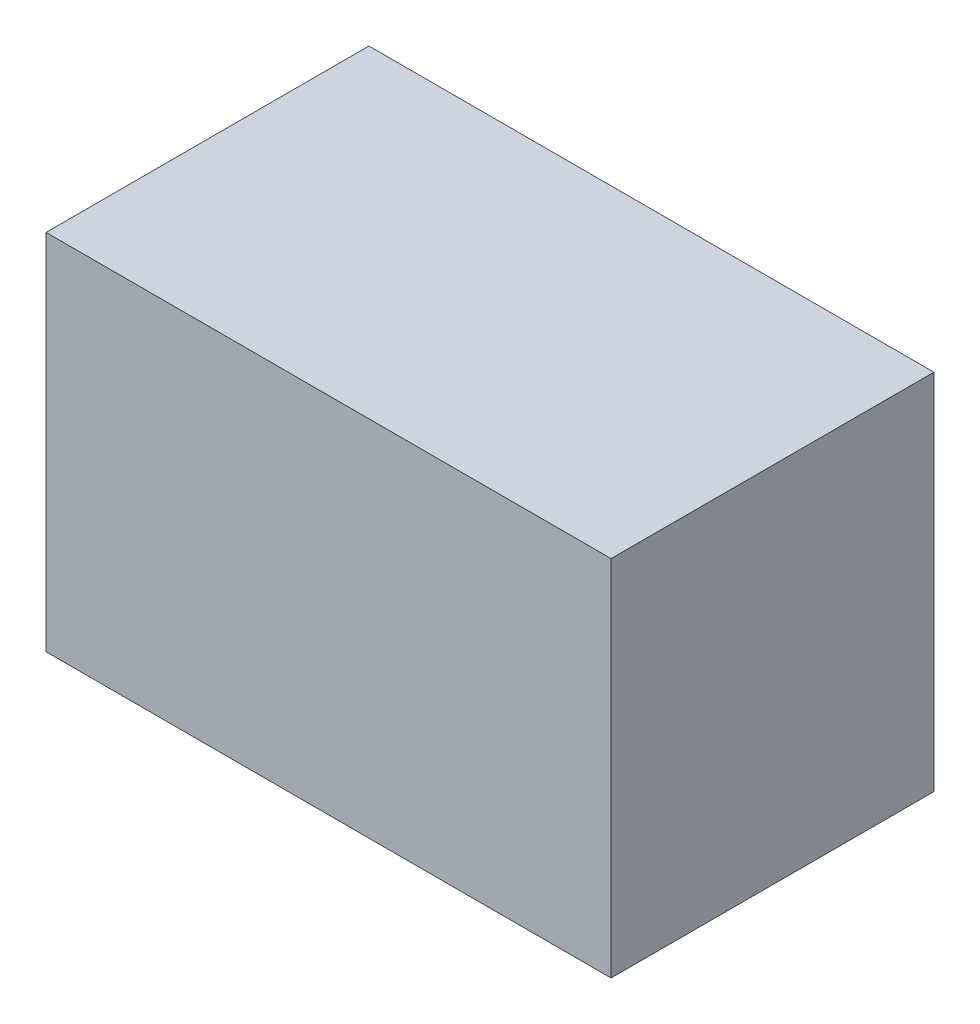
ISO-10303-21;
HEADER;
FILE_DESCRIPTION(('STEP AP214'),'2;1');
FILE_NAME('part.step','',(''),(''),'','','');
FILE_SCHEMA(('AUTOMOTIVE_DESIGN { 1 0 10303 214 1 1 1 1 }'));
ENDSEC;
DATA;
#1=APPLICATION_CONTEXT('core data for automotive mechanical design processes');
#2=APPLICATION_PROTOCOL_DEFINITION('international standard','automotive_design',2000,#1);
#3=PRODUCT_CONTEXT('',#1,'mechanical');
#4=PRODUCT('Part','Part','',(#3));
#5=PRODUCT_RELATED_PRODUCT_CATEGORY('part','',(#4));
#6=PRODUCT_DEFINITION_FORMATION('','',#4);
#7=PRODUCT_DEFINITION_CONTEXT('part definition',#1,'design');
#8=PRODUCT_DEFINITION('design','',#6,#7);
#9=PRODUCT_DEFINITION_SHAPE('','',#8);
#10=(LENGTH_UNIT() NAMED_UNIT(*) SI_UNIT(.MILLI.,.METRE.));
#11=(NAMED_UNIT(*) PLANE_ANGLE_UNIT() SI_UNIT($,.RADIAN.));
#12=(NAMED_UNIT(*) SI_UNIT($,.STERADIAN.) SOLID_ANGLE_UNIT());
#13=UNCERTAINTY_MEASURE_WITH_UNIT(LENGTH_MEASURE(1.E-05),#10,'distance_accuracy_value','');
#14=(GEOMETRIC_REPRESENTATION_CONTEXT(3) GLOBAL_UNCERTAINTY_ASSIGNED_CONTEXT((#13)) GLOBAL_UNIT_ASSIGNED_CONTEXT((#10,
#11,#12)) REPRESENTATION_CONTEXT('',''));
#15=CARTESIAN_POINT('',(0.,0.,0.));
#16=DIRECTION('',(0.,0.,1.));
#17=DIRECTION('',(1.,0.,0.));
#18=AXIS2_PLACEMENT_3D('',#15,#16,#17);
#19=CARTESIAN_POINT('',(-59.5126283572808,4.39895601278922,40.));
#20=DIRECTION('',(1.,0.,0.));
#21=DIRECTION('',(0.,1.,0.));
#22=AXIS2_PLACEMENT_3D('',#19,#20,#21);
#23=PLANE('',#22);
#24=DIRECTION('',(0.,-1.,0.));
#25=VECTOR('',#24,1.);
#26=CARTESIAN_POINT('',(-59.5126283572808,4.39895601278922,0.));
#27=LINE('',#26,#25);
#28=CARTESIAN_POINT('',(-59.5126283572808,4.39895601278922,0.));
#29=VERTEX_POINT('',#28);
#30=CARTESIAN_POINT('',(-59.5126283572808,-40.6010439872108,0.));
#31=VERTEX_POINT('',#30);
#32=EDGE_CURVE('E97',#29,#31,#27,.T.);
#33=ORIENTED_EDGE('',*,*,#32,.T.);
#34=DIRECTION('',(0.,0.,-1.));
#35=VECTOR('',#34,1.);
#36=CARTESIAN_POINT('',(-59.5126283572808,-40.6010439872108,40.));
#37=LINE('',#36,#35);
#38=CARTESIAN_POINT('',(-59.5126283572808,-40.6010439872108,40.));
#39=VERTEX_POINT('',#38);
#40=EDGE_CURVE('E11',#39,#31,#37,.T.);
#41=ORIENTED_EDGE('',*,*,#40,.F.);
#42=DIRECTION('',(0.,-1.,0.));
#43=VECTOR('',#42,1.);
#44=CARTESIAN_POINT('',(-59.5126283572808,4.39895601278922,40.));
#45=LINE('',#44,#43);
#46=CARTESIAN_POINT('',(-59.5126283572808,4.39895601278922,40.));
#47=VERTEX_POINT('',#46);
#48=EDGE_CURVE('E85',#47,#39,#45,.T.);
#49=ORIENTED_EDGE('',*,*,#48,.F.);
#50=DIRECTION('',(0.,0.,-1.));
#51=VECTOR('',#50,1.);
#52=CARTESIAN_POINT('',(-59.5126283572808,4.39895601278922,40.));
#53=LINE('',#52,#51);
#54=EDGE_CURVE('E93',#47,#29,#53,.T.);
#55=ORIENTED_EDGE('',*,*,#54,.T.);
#56=EDGE_LOOP('',(#33,#41,#49,#55));
#57=FACE_BOUND('',#56,.T.);
#58=ADVANCED_FACE('F34',(#57),#23,.F.);
#59=CARTESIAN_POINT('',(-59.5126283572808,-40.6010439872108,40.));
#60=DIRECTION('',(0.,1.,0.));
#61=DIRECTION('',(0.,0.,1.));
#62=AXIS2_PLACEMENT_3D('',#59,#60,#61);
#63=PLANE('',#62);
#64=DIRECTION('',(1.,0.,0.));
#65=VECTOR('',#64,1.);
#66=CARTESIAN_POINT('',(-59.5126283572808,-40.6010439872108,0.));
#67=LINE('',#66,#65);
#68=CARTESIAN_POINT('',(10.4873716427192,-40.6010439872108,0.));
#69=VERTEX_POINT('',#68);
#70=EDGE_CURVE('E89',#31,#69,#67,.T.);
#71=ORIENTED_EDGE('',*,*,#70,.T.);
#72=DIRECTION('',(0.,0.,-1.));
#73=VECTOR('',#72,1.);
#74=CARTESIAN_POINT('',(10.4873716427192,-40.6010439872108,40.));
#75=LINE('',#74,#73);
#76=CARTESIAN_POINT('',(10.4873716427192,-40.6010439872108,40.));
#77=VERTEX_POINT('',#76);
#78=EDGE_CURVE('E42',#77,#69,#75,.T.);
#79=ORIENTED_EDGE('',*,*,#78,.F.);
#80=DIRECTION('',(1.,0.,0.));
#81=VECTOR('',#80,1.);
#82=CARTESIAN_POINT('',(-59.5126283572808,-40.6010439872108,40.));
#83=LINE('',#82,#81);
#84=EDGE_CURVE('E80',#39,#77,#83,.T.);
#85=ORIENTED_EDGE('',*,*,#84,.F.);
#86=ORIENTED_EDGE('',*,*,#40,.T.);
#87=EDGE_LOOP('',(#71,#79,#85,#86));
#88=FACE_BOUND('',#87,.T.);
#89=ADVANCED_FACE('F88',(#88),#63,.F.);
#90=CARTESIAN_POINT('',(10.4873716427192,4.39895601278922,40.));
#91=DIRECTION('',(-1.,0.,0.));
#92=DIRECTION('',(0.,-1.,0.));
#93=AXIS2_PLACEMENT_3D('',#90,#91,#92);
#94=PLANE('',#93);
#95=DIRECTION('',(0.,1.,0.));
#96=VECTOR('',#95,1.);
#97=CARTESIAN_POINT('',(10.4873716427192,4.39895601278922,0.));
#98=LINE('',#97,#96);
#99=CARTESIAN_POINT('',(10.4873716427192,4.39895601278922,0.));
#100=VERTEX_POINT('',#99);
#101=EDGE_CURVE('E67',#69,#100,#98,.T.);
#102=ORIENTED_EDGE('',*,*,#101,.T.);
#103=DIRECTION('',(0.,0.,-1.));
#104=VECTOR('',#103,1.);
#105=CARTESIAN_POINT('',(10.4873716427192,4.39895601278922,40.));
#106=LINE('',#105,#104);
#107=CARTESIAN_POINT('',(10.4873716427192,4.39895601278922,40.));
#108=VERTEX_POINT('',#107);
#109=EDGE_CURVE('E90',#108,#100,#106,.T.);
#110=ORIENTED_EDGE('',*,*,#109,.F.);
#111=DIRECTION('',(0.,1.,0.));
#112=VECTOR('',#111,1.);
#113=CARTESIAN_POINT('',(10.4873716427192,4.39895601278922,40.));
#114=LINE('',#113,#112);
#115=EDGE_CURVE('E83',#77,#108,#114,.T.);
#116=ORIENTED_EDGE('',*,*,#115,.F.);
#117=ORIENTED_EDGE('',*,*,#78,.T.);
#118=EDGE_LOOP('',(#102,#110,#116,#117));
#119=FACE_BOUND('',#118,.T.);
#120=ADVANCED_FACE('F91',(#119),#94,.F.);
#121=CARTESIAN_POINT('',(-59.5126283572808,4.39895601278922,40.));
#122=DIRECTION('',(0.,-1.,0.));
#123=DIRECTION('',(0.,0.,-1.));
#124=AXIS2_PLACEMENT_3D('',#121,#122,#123);
#125=PLANE('',#124);
#126=DIRECTION('',(-1.,0.,0.));
#127=VECTOR('',#126,1.);
#128=CARTESIAN_POINT('',(-59.5126283572808,4.39895601278922,0.));
#129=LINE('',#128,#127);
#130=EDGE_CURVE('E73',#100,#29,#129,.T.);
#131=ORIENTED_EDGE('',*,*,#130,.T.);
#132=ORIENTED_EDGE('',*,*,#54,.F.);
#133=DIRECTION('',(-1.,0.,0.));
#134=VECTOR('',#133,1.);
#135=CARTESIAN_POINT('',(-59.5126283572808,4.39895601278922,40.));
#136=LINE('',#135,#134);
#137=EDGE_CURVE('E50',#108,#47,#136,.T.);
#138=ORIENTED_EDGE('',*,*,#137,.F.);
#139=ORIENTED_EDGE('',*,*,#109,.T.);
#140=EDGE_LOOP('',(#131,#132,#138,#139));
#141=FACE_BOUND('',#140,.T.);
#142=ADVANCED_FACE('F104',(#141),#125,.F.);
#143=CARTESIAN_POINT('',(0.,0.,40.));
#144=DIRECTION('',(0.,0.,1.));
#145=DIRECTION('',(1.,0.,0.));
#146=AXIS2_PLACEMENT_3D('',#143,#144,#145);
#147=PLANE('',#146);
#148=ORIENTED_EDGE('',*,*,#48,.T.);
#149=ORIENTED_EDGE('',*,*,#84,.T.);
#150=ORIENTED_EDGE('',*,*,#115,.T.);
#151=ORIENTED_EDGE('',*,*,#137,.T.);
#152=EDGE_LOOP('',(#148,#149,#150,#151));
#153=FACE_BOUND('',#152,.T.);
#154=ADVANCED_FACE('F81',(#153),#147,.T.);
#155=CARTESIAN_POINT('',(0.,0.,0.));
#156=DIRECTION('',(0.,0.,1.));
#157=DIRECTION('',(1.,0.,0.));
#158=AXIS2_PLACEMENT_3D('',#155,#156,#157);
#159=PLANE('',#158);
#160=ORIENTED_EDGE('',*,*,#32,.F.);
#161=ORIENTED_EDGE('',*,*,#130,.F.);
#162=ORIENTED_EDGE('',*,*,#101,.F.);
#163=ORIENTED_EDGE('',*,*,#70,.F.);
#164=EDGE_LOOP('',(#160,#161,#162,#163));
#165=FACE_BOUND('',#164,.T.);
#166=ADVANCED_FACE('F107',(#165),#159,.F.);
#167=CLOSED_SHELL('',(#58,#89,#120,#142,#154,#166));
#168=MANIFOLD_SOLID_BREP('B2',#167);
#169=ADVANCED_BREP_SHAPE_REPRESENTATION('',(#18,#168),#14);
#170=SHAPE_DEFINITION_REPRESENTATION(#9,#169);
ENDSEC;
END-ISO-10303-21;
